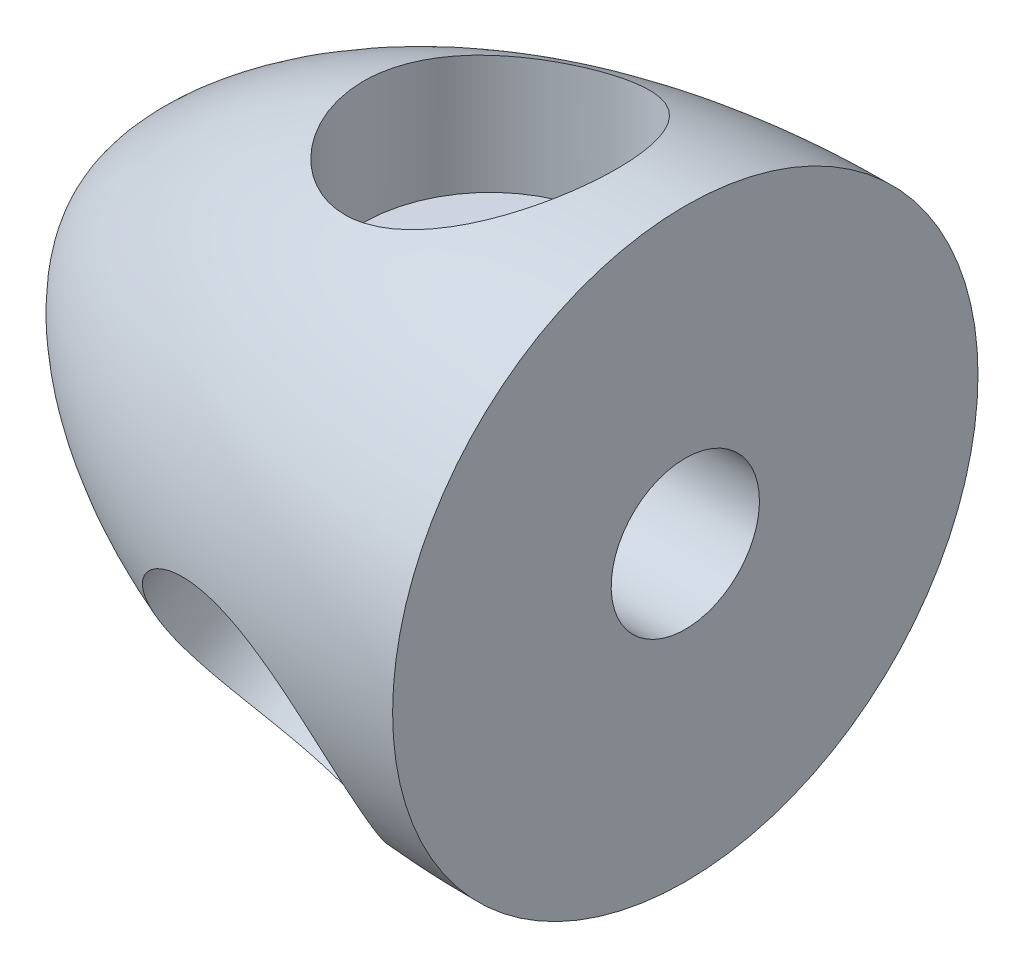
ISO-10303-21;
HEADER;
FILE_DESCRIPTION(('STEP AP214'),'2;1');
FILE_NAME('part.step','',(''),(''),'','','');
FILE_SCHEMA(('AUTOMOTIVE_DESIGN { 1 0 10303 214 1 1 1 1 }'));
ENDSEC;
DATA;
#1=APPLICATION_CONTEXT('core data for automotive mechanical design processes');
#2=APPLICATION_PROTOCOL_DEFINITION('international standard','automotive_design',2000,#1);
#3=PRODUCT_CONTEXT('',#1,'mechanical');
#4=PRODUCT('Part','Part','',(#3));
#5=PRODUCT_RELATED_PRODUCT_CATEGORY('part','',(#4));
#6=PRODUCT_DEFINITION_FORMATION('','',#4);
#7=PRODUCT_DEFINITION_CONTEXT('part definition',#1,'design');
#8=PRODUCT_DEFINITION('design','',#6,#7);
#9=PRODUCT_DEFINITION_SHAPE('','',#8);
#10=(LENGTH_UNIT() NAMED_UNIT(*) SI_UNIT(.MILLI.,.METRE.));
#11=(NAMED_UNIT(*) PLANE_ANGLE_UNIT() SI_UNIT($,.RADIAN.));
#12=(NAMED_UNIT(*) SI_UNIT($,.STERADIAN.) SOLID_ANGLE_UNIT());
#13=UNCERTAINTY_MEASURE_WITH_UNIT(LENGTH_MEASURE(1.E-05),#10,'distance_accuracy_value','');
#14=(GEOMETRIC_REPRESENTATION_CONTEXT(3) GLOBAL_UNCERTAINTY_ASSIGNED_CONTEXT((#13)) GLOBAL_UNIT_ASSIGNED_CONTEXT((#10,
#11,#12)) REPRESENTATION_CONTEXT('',''));
#15=CARTESIAN_POINT('',(0.,0.,0.));
#16=DIRECTION('',(0.,0.,1.));
#17=DIRECTION('',(1.,0.,0.));
#18=AXIS2_PLACEMENT_3D('',#15,#16,#17);
#19=CARTESIAN_POINT('',(0.,0.,0.));
#20=DIRECTION('',(1.,0.,0.));
#21=DIRECTION('',(0.,1.,0.));
#22=AXIS2_PLACEMENT_3D('',#19,#20,#21);
#23=PLANE('',#22);
#24=CARTESIAN_POINT('',(0.,0.,0.));
#25=DIRECTION('',(1.,0.,0.));
#26=DIRECTION('',(0.,1.,0.));
#27=AXIS2_PLACEMENT_3D('',#24,#25,#26);
#28=CIRCLE('',#27,4.825);
#29=CARTESIAN_POINT('',(0.,4.825,0.));
#30=VERTEX_POINT('',#29);
#31=EDGE_CURVE('E60',#30,#30,#28,.T.);
#32=ORIENTED_EDGE('',*,*,#31,.F.);
#33=EDGE_LOOP('',(#32));
#34=FACE_BOUND('',#33,.T.);
#35=CARTESIAN_POINT('',(0.,0.,0.));
#36=DIRECTION('',(1.,0.,0.));
#37=DIRECTION('',(0.,1.,0.));
#38=AXIS2_PLACEMENT_3D('',#35,#36,#37);
#39=CIRCLE('',#38,19.05);
#40=CARTESIAN_POINT('',(0.,19.05,0.));
#41=VERTEX_POINT('',#40);
#42=EDGE_CURVE('E11',#41,#41,#39,.T.);
#43=ORIENTED_EDGE('',*,*,#42,.T.);
#44=EDGE_LOOP('',(#43));
#45=FACE_BOUND('',#44,.T.);
#46=ADVANCED_FACE('F33',(#34,#45),#23,.T.);
#47=CARTESIAN_POINT('',(0.,19.05,0.));
#48=CARTESIAN_POINT('',(-25.4333333333333,19.05,0.));
#49=CARTESIAN_POINT('',(-38.1,6.30000000000003,0.));
#50=CARTESIAN_POINT('',(-38.1,0.,0.));
#51=B_SPLINE_CURVE_WITH_KNOTS('',3,(#47,#48,#49,#50),.UNSPECIFIED.,.F.,.F.,(4,4),(0.,1.),.UNSPECIFIED.);
#52=CARTESIAN_POINT('',(0.,0.,0.));
#53=DIRECTION('',(1.,0.,0.));
#54=AXIS1_PLACEMENT('',#52,#53);
#55=SURFACE_OF_REVOLUTION('',#51,#54);
#56=CARTESIAN_POINT('',(-12.7,-0.782808314860762,-17.8658637739265));
#57=CARTESIAN_POINT('',(-12.4605412191964,-0.809010097268537,-17.9112441395069));
#58=CARTESIAN_POINT('',(-12.2218116192183,-0.845969869314384,-17.9544071675341));
#59=CARTESIAN_POINT('',(-11.7476137893859,-0.940578636545913,-18.0357942444389));
#60=CARTESIAN_POINT('',(-11.512146254658,-0.998231973059112,-18.0740172546541));
#61=CARTESIAN_POINT('',(-11.0459143717464,-1.13327139302543,-18.1449808208465));
#62=CARTESIAN_POINT('',(-10.8151535660187,-1.21067178699439,-18.1777173722079));
#63=CARTESIAN_POINT('',(-10.3598431169356,-1.38411315065787,-18.2370736364306));
#64=CARTESIAN_POINT('',(-10.1352960046177,-1.48016159223076,-18.2636908880498));
#65=CARTESIAN_POINT('',(-9.69456480261892,-1.68935375830582,-18.3100634020428));
#66=CARTESIAN_POINT('',(-9.47835406963317,-1.80243614957719,-18.3298424767099));
#67=CARTESIAN_POINT('',(-9.05455452237443,-2.04482716438032,-18.3620101753979));
#68=CARTESIAN_POINT('',(-8.84696890900604,-2.17414174156891,-18.3743960781014));
#69=CARTESIAN_POINT('',(-8.44165027879485,-2.44777678486999,-18.3910851791385));
#70=CARTESIAN_POINT('',(-8.24391548319116,-2.59209452722903,-18.3953898418879));
#71=CARTESIAN_POINT('',(-7.85934755386701,-2.89458616968398,-18.3952369053858));
#72=CARTESIAN_POINT('',(-7.672514478756,-3.05276014426187,-18.3907792590311));
#73=CARTESIAN_POINT('',(-7.30257540378188,-3.38930342263076,-18.3720034195249));
#74=CARTESIAN_POINT('',(-7.12002977907378,-3.56826526648828,-18.3572439778409));
#75=CARTESIAN_POINT('',(-6.76943600952125,-3.93854471756861,-18.3166624765897));
#76=CARTESIAN_POINT('',(-6.60138091047927,-4.12985632001884,-18.2908457594565));
#77=CARTESIAN_POINT('',(-6.28093238559516,-4.52350756447016,-18.2274425860286));
#78=CARTESIAN_POINT('',(-6.12854624378324,-4.72585226914393,-18.1898506883668));
#79=CARTESIAN_POINT('',(-5.84098590828864,-5.13975275486093,-18.102318927421));
#80=CARTESIAN_POINT('',(-5.70580286140662,-5.35130372225984,-18.0523854547081));
#81=CARTESIAN_POINT('',(-5.45878509796976,-5.77367102278403,-17.9418546703385));
#82=CARTESIAN_POINT('',(-5.34625536945976,-5.9842062762982,-17.8817379941296));
#83=CARTESIAN_POINT('',(-5.13961942055577,-6.41034081785548,-17.7494346977502));
#84=CARTESIAN_POINT('',(-5.04550359676889,-6.62593740020257,-17.6772544057282));
#85=CARTESIAN_POINT('',(-4.87681693312492,-7.06025863383021,-17.520806494415));
#86=CARTESIAN_POINT('',(-4.80223722960859,-7.27898181888373,-17.4365443836656));
#87=CARTESIAN_POINT('',(-4.67358095814146,-7.71755211190671,-17.2561346276906));
#88=CARTESIAN_POINT('',(-4.61950213669058,-7.93739909365203,-17.159988290346));
#89=CARTESIAN_POINT('',(-4.53697912531533,-8.35404708928466,-16.9665315514729));
#90=CARTESIAN_POINT('',(-4.50651022069561,-8.55095134449727,-16.870301830031));
#91=CARTESIAN_POINT('',(-4.46317921330921,-8.94227257821454,-16.6692178743022));
#92=CARTESIAN_POINT('',(-4.45031580537277,-9.13668974003923,-16.5643642799505));
#93=CARTESIAN_POINT('',(-4.44235988364154,-9.52138823633618,-16.346829434809));
#94=CARTESIAN_POINT('',(-4.44726214105618,-9.71167077112775,-16.2341504967494));
#95=CARTESIAN_POINT('',(-4.47476301762476,-10.086646248822,-16.0018701536386));
#96=CARTESIAN_POINT('',(-4.49736129717471,-10.2713392989216,-15.8822688814747));
#97=CARTESIAN_POINT('',(-4.55818860561837,-10.6234640151894,-15.6441708954853));
#98=CARTESIAN_POINT('',(-4.59545837697264,-10.7912805644767,-15.5259962930948));
#99=CARTESIAN_POINT('',(-4.68509788179873,-11.1197471167671,-15.2853716737885));
#100=CARTESIAN_POINT('',(-4.73747281590798,-11.2803946294695,-15.1629201971481));
#101=CARTESIAN_POINT('',(-4.85677161239576,-11.5935602705427,-14.9148227401486));
#102=CARTESIAN_POINT('',(-4.92369317260539,-11.7460796805276,-14.7891772680508));
#103=CARTESIAN_POINT('',(-5.07145657213194,-12.0423131421777,-14.5357015641885));
#104=CARTESIAN_POINT('',(-5.15229952519227,-12.1860264880893,-14.4078711583619));
#105=CARTESIAN_POINT('',(-5.33034022249695,-12.4690711094072,-14.1464498659214));
#106=CARTESIAN_POINT('',(-5.42802115343728,-12.6080595134843,-14.0128170052718));
#107=CARTESIAN_POINT('',(-5.63672906050956,-12.8755036240972,-13.7454457988566));
#108=CARTESIAN_POINT('',(-5.74775656801022,-13.0039589109342,-13.611707449102));
#109=CARTESIAN_POINT('',(-5.98233021253153,-13.2500209865372,-13.345194667243));
#110=CARTESIAN_POINT('',(-6.10587759776776,-13.3676266913767,-13.2124203326666));
#111=CARTESIAN_POINT('',(-6.36464518150935,-13.5917757947713,-12.9488848495021));
#112=CARTESIAN_POINT('',(-6.49986957238244,-13.6983151897203,-12.8181244439912));
#113=CARTESIAN_POINT('',(-6.94797876696902,-14.0198439111685,-12.406382287535));
#114=CARTESIAN_POINT('',(-7.28154588695901,-14.2137816697349,-12.1309603286107));
#115=CARTESIAN_POINT('',(-7.99249701573419,-14.5474858659454,-11.6047484641233));
#116=CARTESIAN_POINT('',(-8.36990393976604,-14.6872238060394,-11.3539715682044));
#117=CARTESIAN_POINT('',(-8.97759387388042,-14.8604591608365,-10.9949468532924));
#118=CARTESIAN_POINT('',(-9.19536693045009,-14.9132218624605,-10.874344679459));
#119=CARTESIAN_POINT('',(-9.63998778386072,-15.0030777353524,-10.6446464084535));
#120=CARTESIAN_POINT('',(-9.86683231204893,-15.0401764959765,-10.5355462174788));
#121=CARTESIAN_POINT('',(-10.3283835467537,-15.0987171138688,-10.3302872434051));
#122=CARTESIAN_POINT('',(-10.5630936838458,-15.1201520439269,-10.2341342013995));
#123=CARTESIAN_POINT('',(-11.0387213364155,-15.1473133186741,-10.0563174148806));
#124=CARTESIAN_POINT('',(-11.2796358918223,-15.1530470190993,-9.97464690234724));
#125=CARTESIAN_POINT('',(-11.7625778210083,-15.148831545144,-9.8281945496255));
#126=CARTESIAN_POINT('',(-12.0045374308484,-15.1391104296026,-9.76318325295562));
#127=CARTESIAN_POINT('',(-12.4912389765208,-15.1044028122953,-9.64967820579606));
#128=CARTESIAN_POINT('',(-12.7359809121101,-15.079416311862,-9.60118445386451));
#129=CARTESIAN_POINT('',(-13.2261329826634,-15.0142306428809,-9.52168482575803));
#130=CARTESIAN_POINT('',(-13.4715426113173,-14.9740408835808,-9.49066816256817));
#131=CARTESIAN_POINT('',(-13.961033487477,-14.8785440134598,-9.44671517683383));
#132=CARTESIAN_POINT('',(-14.205114850229,-14.8232382362064,-9.43377725995878));
#133=CARTESIAN_POINT('',(-14.6695152379794,-14.7029186466525,-9.42653905921418));
#134=CARTESIAN_POINT('',(-14.8901216381431,-14.6390954518101,-9.43077762342878));
#135=CARTESIAN_POINT('',(-15.326537010586,-14.49910199188,-9.45452713954318));
#136=CARTESIAN_POINT('',(-15.5423462615532,-14.4229324461904,-9.47403720185544));
#137=CARTESIAN_POINT('',(-15.9673849411216,-14.2585221658651,-9.52789236542033));
#138=CARTESIAN_POINT('',(-16.1766150841391,-14.1702827474864,-9.56223584992217));
#139=CARTESIAN_POINT('',(-16.5868313272251,-13.9820492127786,-9.64503156555277));
#140=CARTESIAN_POINT('',(-16.7878174756904,-13.8820551654691,-9.69348371384223));
#141=CARTESIAN_POINT('',(-17.1721779109224,-13.6748829994183,-9.80133105954806));
#142=CARTESIAN_POINT('',(-17.3559345718448,-13.5681472823716,-9.86021584962064));
#143=CARTESIAN_POINT('',(-17.7131730553399,-13.3445025106488,-9.98907381540146));
#144=CARTESIAN_POINT('',(-17.886651181088,-13.2275898325638,-10.0590509477716));
#145=CARTESIAN_POINT('',(-18.2220488345541,-12.9840548060418,-10.2088900628887));
#146=CARTESIAN_POINT('',(-18.3839717464499,-12.8574353231596,-10.2887491326228));
#147=CARTESIAN_POINT('',(-18.6953448168885,-12.5948227351442,-10.4571605444565));
#148=CARTESIAN_POINT('',(-18.8447892334259,-12.4588253667392,-10.5457168482626));
#149=CARTESIAN_POINT('',(-19.1344710625752,-12.1737570264932,-10.7329705313621));
#150=CARTESIAN_POINT('',(-19.2742981242203,-12.0244163413494,-10.8318923467974));
#151=CARTESIAN_POINT('',(-19.5386733982195,-11.7169615864537,-11.0360903630903));
#152=CARTESIAN_POINT('',(-19.6632279097657,-11.5588511731384,-11.1413639172477));
#153=CARTESIAN_POINT('',(-19.8963735714554,-11.2343487999817,-11.356946798654));
#154=CARTESIAN_POINT('',(-20.0049568043138,-11.0679527871416,-11.4672585881874));
#155=CARTESIAN_POINT('',(-20.2053317366402,-10.7277327146794,-11.6914501450831));
#156=CARTESIAN_POINT('',(-20.2971294718257,-10.5539113529039,-11.8053286126212));
#157=CARTESIAN_POINT('',(-20.4654155171889,-10.1952228406121,-12.0382117380654));
#158=CARTESIAN_POINT('',(-20.5414697875791,-10.0101889191632,-12.1572735394713));
#159=CARTESIAN_POINT('',(-20.674790079695,-9.63412289295948,-12.3964480083597));
#160=CARTESIAN_POINT('',(-20.7320557772986,-9.44309068479033,-12.5165606939343));
#161=CARTESIAN_POINT('',(-20.8273636304451,-9.05617762611024,-12.7565775458409));
#162=CARTESIAN_POINT('',(-20.8654070741636,-8.86029710143138,-12.8764817256091));
#163=CARTESIAN_POINT('',(-20.9219820203161,-8.4649402256296,-13.1149553330591));
#164=CARTESIAN_POINT('',(-20.9405137795724,-8.26546392187122,-13.2335247782889));
#165=CARTESIAN_POINT('',(-20.9578436499569,-7.86608390455181,-13.4672866233199));
#166=CARTESIAN_POINT('',(-20.9568161645096,-7.66619984507218,-13.5824997027076));
#167=CARTESIAN_POINT('',(-20.9354622745526,-7.26569664443719,-13.8098158652024));
#168=CARTESIAN_POINT('',(-20.9151359530587,-7.06507750644753,-13.9219189616852));
#169=CARTESIAN_POINT('',(-20.8553405048699,-6.66462114147466,-14.1423536080259));
#170=CARTESIAN_POINT('',(-20.8158712168788,-6.46478392109408,-14.2506851260967));
#171=CARTESIAN_POINT('',(-20.7180881182425,-6.06746613861438,-14.4630781280623));
#172=CARTESIAN_POINT('',(-20.6597742693946,-5.86998558129368,-14.5671396033001));
#173=CARTESIAN_POINT('',(-20.5249518817585,-5.47962530567179,-14.7703268972105));
#174=CARTESIAN_POINT('',(-20.4485030331443,-5.28673273098365,-14.8694676441995));
#175=CARTESIAN_POINT('',(-20.2778549786277,-4.90649700689581,-15.0629958543927));
#176=CARTESIAN_POINT('',(-20.183655807443,-4.71915384664282,-15.1573833268934));
#177=CARTESIAN_POINT('',(-19.9781683222644,-4.35164796565476,-15.3413563089616));
#178=CARTESIAN_POINT('',(-19.8668816825867,-4.17148454358893,-15.4309422878447));
#179=CARTESIAN_POINT('',(-19.6279094204495,-3.81984468577733,-15.6054410168709));
#180=CARTESIAN_POINT('',(-19.5002162400072,-3.64837230481122,-15.6903515872829));
#181=CARTESIAN_POINT('',(-19.2276776881195,-3.31377760668062,-15.8566320729106));
#182=CARTESIAN_POINT('',(-19.0826429986075,-3.15078185054197,-15.9379465264274));
#183=CARTESIAN_POINT('',(-18.7777536392542,-2.83711174726639,-16.0961330678985));
#184=CARTESIAN_POINT('',(-18.6179059284559,-2.68643167630493,-16.173007214596));
#185=CARTESIAN_POINT('',(-18.2844147443989,-2.3988535659652,-16.3226598191815));
#186=CARTESIAN_POINT('',(-18.1107684868983,-2.26195832075871,-16.3954374453953));
#187=CARTESIAN_POINT('',(-17.7509657769628,-2.0034881483468,-16.5371770979267));
#188=CARTESIAN_POINT('',(-17.5648096598338,-1.88191281076781,-16.6061392264221));
#189=CARTESIAN_POINT('',(-17.1840425608865,-1.65703059260396,-16.7395940593867));
#190=CARTESIAN_POINT('',(-16.9895842304809,-1.55349418712382,-16.8041354072839));
#191=CARTESIAN_POINT('',(-16.591345955905,-1.36382821768515,-16.9299924122986));
#192=CARTESIAN_POINT('',(-16.3875658723727,-1.27769891407061,-16.9913080211611));
#193=CARTESIAN_POINT('',(-15.9724501510349,-1.12386081638953,-17.1108121371168));
#194=CARTESIAN_POINT('',(-15.7611196984007,-1.05613964566308,-17.1690027240827));
#195=CARTESIAN_POINT('',(-15.3325011094864,-0.939748594727,-17.2823496423948));
#196=CARTESIAN_POINT('',(-15.1152137358125,-0.891076287952263,-17.3375063594449));
#197=CARTESIAN_POINT('',(-14.7159663652898,-0.820195501817679,-17.4350816137368));
#198=CARTESIAN_POINT('',(-14.5346874746646,-0.794800532283546,-17.478005958465));
#199=CARTESIAN_POINT('',(-14.1702292839433,-0.757150222579637,-17.561720812882));
#200=CARTESIAN_POINT('',(-13.9870495267891,-0.744898120126977,-17.602510794422));
#201=CARTESIAN_POINT('',(-13.6198120038585,-0.733493661990646,-17.6818221860005));
#202=CARTESIAN_POINT('',(-13.4357543094777,-0.734340258657499,-17.7203437772202));
#203=CARTESIAN_POINT('',(-13.0676548319402,-0.748951359078316,-17.7949662397281));
#204=CARTESIAN_POINT('',(-12.8836130524838,-0.762717219298245,-17.8310668563982));
#205=CARTESIAN_POINT('',(-12.7,-0.782808314860762,-17.8658637739265));
#206=B_SPLINE_CURVE_WITH_KNOTS('',3,(#56,#57,#58,#59,#60,#61,#62,#63,#64,#65,#66,#67,#68,#69,
#70,#71,#72,#73,#74,#75,#76,#77,#78,#79,#80,#81,#82,#83,#84,#85,#86,#87,#88,#89,#90,#91,#92,#93,
#94,#95,#96,#97,#98,#99,#100,#101,#102,#103,#104,#105,#106,#107,#108,#109,#110,#111,#112,#113,
#114,#115,#116,#117,#118,#119,#120,#121,#122,#123,#124,#125,#126,#127,#128,#129,#130,#131,#132,
#133,#134,#135,#136,#137,#138,#139,#140,#141,#142,#143,#144,#145,#146,#147,#148,#149,#150,#151,
#152,#153,#154,#155,#156,#157,#158,#159,#160,#161,#162,#163,#164,#165,#166,#167,#168,#169,#170,
#171,#172,#173,#174,#175,#176,#177,#178,#179,#180,#181,#182,#183,#184,#185,#186,#187,#188,#189,
#190,#191,#192,#193,#194,#195,#196,#197,#198,#199,#200,#201,#202,#203,#204,#205),.UNSPECIFIED.,
.T.,.F.,(4,2,2,2,2,2,2,2,2,2,2,2,2,2,2,2,2,2,2,2,2,2,2,2,2,2,2,2,2,2,2,2,2,2,2,2,2,2,2,2,2,2,2,
2,2,2,2,2,2,2,2,2,2,2,2,2,2,2,2,2,2,2,2,2,2,2,2,2,2,2,2,2,2,2,4),(0.,0.735189109765677,
1.47053254596554,2.20641040021214,2.94258371592618,3.67616703726041,4.41002021353002,
5.14374039412699,5.87746451896211,6.6447145035238,7.41159420096632,8.17882880127432,
8.94566695033751,9.68319006988842,10.4203275180978,11.1571299409134,11.8938513493562,
12.5567991592394,13.2196978193407,13.8824013909569,14.5450922449544,15.170196031612,
15.795515296057,16.4207356685819,17.0460060834306,17.6937379857401,18.3414956848175,
18.9893180281542,19.6373739324057,21.0531936380813,22.4697567572263,23.2323883351739,
23.9947475532189,24.7574437151378,25.5197825068139,26.270975868211,27.0221691640337,
27.772898307371,28.5235612411407,29.2117662767927,29.8999312264577,30.5880211893419,
31.2761071121731,31.9368944790764,32.5979180828387,33.25874729116,33.9198789246246,
34.6008314404914,35.2815021446615,35.9625091419971,36.6432707796872,37.3408435285258,
38.0384283105796,38.7359663379232,39.4334951838184,40.1248073285917,40.8161164996338,
41.5074314956607,42.1987478931698,42.8878196900907,43.5768901392673,44.2658931128889,
44.9552146344643,45.6529000965906,46.3502594372285,47.0477598486321,47.7452415721548,
48.4330712404003,49.1209111951989,49.8082875322292,50.4955762783795,51.0591542816163,
51.6228710892239,52.1865428103265,52.7502737211076),.UNSPECIFIED.);
#207=CARTESIAN_POINT('',(-12.7,-0.782808314860762,-17.8658637739265));
#208=VERTEX_POINT('',#207);
#209=EDGE_CURVE('E36',#208,#208,#206,.T.);
#210=ORIENTED_EDGE('',*,*,#209,.F.);
#211=EDGE_LOOP('',(#210));
#212=FACE_BOUND('',#211,.T.);
#213=CARTESIAN_POINT('',(-12.7,-15.0808877313421,9.61086377392642));
#214=CARTESIAN_POINT('',(-12.4605412191964,-15.1070873895638,9.65624536590619));
#215=CARTESIAN_POINT('',(-12.2218116192183,-15.1259877823167,9.70983498142956));
#216=CARTESIAN_POINT('',(-11.7476137893859,-15.1491666748402,9.8324621157252));
#217=CARTESIAN_POINT('',(-11.512146254658,-15.1534421044391,9.90150287486616));
#218=CARTESIAN_POINT('',(-11.0459143717464,-15.1473786455218,10.0539322261655));
#219=CARTESIAN_POINT('',(-10.8151535660187,-15.1370291336485,10.1373312092863));
#220=CARTESIAN_POINT('',(-10.3598431169356,-15.1017124845074,10.3172139683972));
#221=CARTESIAN_POINT('',(-10.1352960046177,-15.0767394798021,10.4137029846029));
#222=CARTESIAN_POINT('',(-9.69456480261892,-15.0123031719198,10.618054971693));
#223=CARTESIAN_POINT('',(-9.47835406963317,-14.9728911574092,10.7258767325883));
#224=CARTESIAN_POINT('',(-9.05455452237443,-14.8795536942528,10.9518773584009));
#225=CARTESIAN_POINT('',(-8.84696890900603,-14.8256229120485,11.0700600186776));
#226=CARTESIAN_POINT('',(-8.44165027879484,-14.7032585758624,11.3153794680605));
#227=CARTESIAN_POINT('',(-8.24391548319116,-14.6348276519786,11.442514630535));
#228=CARTESIAN_POINT('',(-7.85934755386701,-14.4834493838551,11.7044036090824));
#229=CARTESIAN_POINT('',(-7.67251447875599,-14.4005019615819,11.8391574661071));
#230=CARTESIAN_POINT('',(-7.30257540378187,-14.2159699684077,12.1212245748943));
#231=CARTESIAN_POINT('',(-7.12002977907378,-14.113706995035,12.268830357141));
#232=CARTESIAN_POINT('',(-6.76943600952125,-13.8934226584875,12.5692110176503));
#233=CARTESIAN_POINT('',(-6.60138091047927,-13.7754089243827,12.7219833668444));
#234=CARTESIAN_POINT('',(-6.28093238559516,-13.523674543288,13.0311937580566));
#235=CARTESIAN_POINT('',(-6.12854624378324,-13.3899466525995,13.1876334637945));
#236=CARTESIAN_POINT('',(-5.84098590828864,-13.1071916811239,13.5023159185912));
#237=CARTESIAN_POINT('',(-5.70580286140662,-12.9581725415559,13.6605576941973));
#238=CARTESIAN_POINT('',(-5.45878509796975,-12.6512664241295,13.9710731139944));
#239=CARTESIAN_POINT('',(-5.34625536945975,-12.4939362285845,14.1233436538254));
#240=CARTESIAN_POINT('',(-5.13961942055577,-12.1662909421369,14.4262353440543));
#241=CARTESIAN_POINT('',(-5.04550359676888,-11.9959826844196,14.576857315325));
#242=CARTESIAN_POINT('',(-4.87681693312492,-11.6433342020396,14.8747665813929));
#243=CARTESIAN_POINT('',(-4.80223722960859,-11.4609994810273,15.0220553606712));
#244=CARTESIAN_POINT('',(-4.67358095814146,-11.085474902751,15.3116634977868));
#245=CARTESIAN_POINT('',(-4.61950213669058,-10.892286241257,15.4539834002513));
#246=CARTESIAN_POINT('',(-4.53697912531533,-10.5164237930433,15.7180827794685));
#247=CARTESIAN_POINT('',(-4.50651022069561,-10.3346342820692,15.8404920058749));
#248=CARTESIAN_POINT('',(-4.46317921330921,-9.96482985125597,16.0788441574499));
#249=CARTESIAN_POINT('',(-4.45031580537277,-9.77681539395692,16.1947875613459));
#250=CARTESIAN_POINT('',(-4.44235988364154,-9.39607544370766,16.419178809366));
#251=CARTESIAN_POINT('',(-4.44726214105618,-9.20335135348079,16.5276288493622));
#252=CARTESIAN_POINT('',(-4.47476301762475,-8.81470293670001,16.7362269672862));
#253=CARTESIAN_POINT('',(-4.49736129717471,-8.61877867163124,16.8363752044929));
#254=CARTESIAN_POINT('',(-4.55818860561837,-8.23651740904061,17.0222751610865));
#255=CARTESIAN_POINT('',(-4.59545837697264,-8.05026692664474,17.1085212547495));
#256=CARTESIAN_POINT('',(-4.68509788179874,-7.67764661740427,17.2726693236733));
#257=CARTESIAN_POINT('',(-4.73747281590798,-7.49127677155162,17.3505684124082));
#258=CARTESIAN_POINT('',(-4.85677161239576,-7.11983525063909,17.4977290846703));
#259=CARTESIAN_POINT('',(-4.92369317260539,-6.93476337493948,17.5669920322386));
#260=CARTESIAN_POINT('',(-5.07145657213194,-6.56713024532757,17.6967998835474));
#261=CARTESIAN_POINT('',(-5.15229952519227,-6.38456919354981,17.7573440890563));
#262=CARTESIAN_POINT('',(-5.33034022249695,-6.01664940254719,17.871757275302));
#263=CARTESIAN_POINT('',(-5.42802115343729,-5.8314257484057,17.9253083337394));
#264=CARTESIAN_POINT('',(-5.63672906050956,-5.46615343610327,18.0232361244151));
#265=CARTESIAN_POINT('',(-5.74775656801023,-5.28610498433708,18.067612491189));
#266=CARTESIAN_POINT('',(-5.98233021253153,-4.93226710701235,18.1474521086397));
#267=CARTESIAN_POINT('',(-6.10587759776776,-4.75847830787888,18.1829144693724));
#268=CARTESIAN_POINT('',(-6.36464518150936,-4.41817533296253,18.2452655455655));
#269=CARTESIAN_POINT('',(-6.49986957238244,-4.25166380250643,18.2721511653397));
#270=CARTESIAN_POINT('',(-6.94797876696902,-3.73432027448224,18.344732127932));
#271=CARTESIAN_POINT('',(-7.28154588695901,-3.39882898201055,18.3749761741414));
#272=CARTESIAN_POINT('',(-7.9924970157342,-2.77626404148639,18.4008665531655));
#273=CARTESIAN_POINT('',(-8.36990393976605,-2.4892159088915,18.3964947111999));
#274=CARTESIAN_POINT('',(-8.97759387388042,-2.09167370779263,18.3670085718318));
#275=CARTESIAN_POINT('',(-9.1953669304501,-1.96084781068928,18.3524013248938));
#276=CARTESIAN_POINT('',(-9.63998778386073,-1.71699533634722,18.3153696579946));
#277=CARTESIAN_POINT('',(-9.86683231204894,-1.6039624190933,18.2929480316567));
#278=CARTESIAN_POINT('',(-10.3283835467537,-1.39693262424467,18.2410162068678));
#279=CARTESIAN_POINT('',(-10.5630936838459,-1.30294418218764,18.2115028798236));
#280=CARTESIAN_POINT('',(-11.0387213364155,-1.13536969046935,18.1461168404944));
#281=CARTESIAN_POINT('',(-11.2796358918223,-1.06177410166273,18.1102471144537));
#282=CARTESIAN_POINT('',(-11.7625778210084,-0.937050380739385,18.0333702305585));
#283=CARTESIAN_POINT('',(-12.0045374308485,-0.885609504060962,17.9924458492116));
#284=CARTESIAN_POINT('',(-12.4912389765208,-0.804665058416672,17.9056356473389));
#285=CARTESIAN_POINT('',(-12.7359809121101,-0.77516148753582,17.8597498272462));
#286=CARTESIAN_POINT('',(-13.2261329826635,-0.738905624494712,17.7635475678927));
#287=CARTESIAN_POINT('',(-13.4715426113173,-0.732139285881723,17.7132338837719));
#288=CARTESIAN_POINT('',(-13.961033487477,-0.741823318724119,17.608554675398));
#289=CARTESIAN_POINT('',(-14.205114850229,-0.758271642664977,17.5541895088829));
#290=CARTESIAN_POINT('',(-14.6695152379794,-0.812162971719423,17.4463705873841));
#291=CARTESIAN_POINT('',(-14.8901216381432,-0.847745273426014,17.3932173614072));
#292=CARTESIAN_POINT('',(-15.326537010586,-0.93830968767377,17.2838542268012));
#293=CARTESIAN_POINT('',(-15.5423462615532,-0.993290670110379,17.2276444963954));
#294=CARTESIAN_POINT('',(-15.9673849411216,-1.12213575004519,17.1121885987728));
#295=CARTESIAN_POINT('',(-16.1766150841391,-1.1959977892676,17.0529427630927));
#296=CARTESIAN_POINT('',(-16.5868313272251,-1.36181774968212,16.9313255980069));
#297=CARTESIAN_POINT('',(-16.7878174756904,-1.45377556462348,16.8689542869543));
#298=CARTESIAN_POINT('',(-17.1721779109224,-1.65076018876082,16.7434616010502));
#299=CARTESIAN_POINT('',(-17.3559345718448,-1.75512377138355,16.680468153633));
#300=CARTESIAN_POINT('',(-17.7131730553399,-1.97854042909115,16.5512150827878));
#301=CARTESIAN_POINT('',(-17.886651181088,-2.09759874245016,16.4849542997268));
#302=CARTESIAN_POINT('',(-18.2220488345542,-2.34913073588317,16.348966337606));
#303=CARTESIAN_POINT('',(-18.3839717464499,-2.48160046043657,16.279240183683));
#304=CARTESIAN_POINT('',(-18.6953448168886,-2.75875531537949,16.1360167170249));
#305=CARTESIAN_POINT('',(-18.844789233426,-2.90344600834337,16.0625176930414));
#306=CARTESIAN_POINT('',(-19.1344710625752,-3.20814662498265,15.9092681101235));
#307=CARTESIAN_POINT('',(-19.2742981242203,-3.36848577271,15.829396190688));
#308=CARTESIAN_POINT('',(-19.5386733982195,-3.69905381966986,15.6652315705805));
#309=CARTESIAN_POINT('',(-19.6632279097657,-3.86927859857453,15.5809407131252));
#310=CARTESIAN_POINT('',(-19.8963735714554,-4.21823003707181,15.4077048550864));
#311=CARTESIAN_POINT('',(-20.0049568043138,-4.39696085556474,15.3187575756452));
#312=CARTESIAN_POINT('',(-20.2053317366402,-4.76122647538148,15.1362141284634));
#313=CARTESIAN_POINT('',(-20.2971294718257,-4.9467588021012,15.0426196472144));
#314=CARTESIAN_POINT('',(-20.4654155171889,-5.32778576099456,14.8484278462461));
#315=CARTESIAN_POINT('',(-20.5414697875791,-5.52341326635688,14.7477146704125));
#316=CARTESIAN_POINT('',(-20.674790079695,-5.91857744545271,14.541619172664));
#317=CARTESIAN_POINT('',(-20.7320557772986,-6.11811418656163,14.4362367702358));
#318=CARTESIAN_POINT('',(-20.8273636304451,-6.5194314069892,14.2211686583162));
#319=CARTESIAN_POINT('',(-20.8654070741636,-6.72121173502785,14.1114832377218));
#320=CARTESIAN_POINT('',(-20.9219820203161,-7.12541437511253,13.8883309434416));
#321=CARTESIAN_POINT('',(-20.9405137795724,-7.32783667867339,13.7748641195487));
#322=CARTESIAN_POINT('',(-20.9578436499569,-7.72997038356541,13.5458718013017));
#323=CARTESIAN_POINT('',(-20.9568161645096,-7.92968986690324,13.4303736676747));
#324=CARTESIAN_POINT('',(-20.9354622745526,-8.32680303863201,13.1971858028752));
#325=CARTESIAN_POINT('',(-20.9151359530587,-8.52419673702384,13.0794960811322));
#326=CARTESIAN_POINT('',(-20.8553405048699,-8.91532692311558,12.8429080191289));
#327=CARTESIAN_POINT('',(-20.8158712168788,-9.10906337998574,12.724009668693));
#328=CARTESIAN_POINT('',(-20.7180881182425,-9.49166000651382,12.4861188766731));
#329=CARTESIAN_POINT('',(-20.6597742693946,-9.6805201662854,12.3671264348988));
#330=CARTESIAN_POINT('',(-20.5249518817585,-10.0516656623489,12.1306581665371));
#331=CARTESIAN_POINT('',(-20.4485030331443,-10.2339703551357,12.0131786701503));
#332=CARTESIAN_POINT('',(-20.2778549786277,-10.5916885635558,11.7806489787605));
#333=CARTESIAN_POINT('',(-20.183655807443,-10.7671020926669,11.6655987790065));
#334=CARTESIAN_POINT('',(-19.9781683222644,-11.110180309242,11.4393158410647));
#335=CARTESIAN_POINT('',(-19.8668816825867,-11.2778457538106,11.3280827301646));
#336=CARTESIAN_POINT('',(-19.6279094204495,-11.6047860149812,11.1108030448297));
#337=CARTESIAN_POINT('',(-19.5002162400072,-11.7640569164908,11.0047588920716));
#338=CARTESIAN_POINT('',(-19.2276776881195,-12.0753573902633,10.7981316263328));
#339=CARTESIAN_POINT('',(-19.0826429986075,-12.2272756507731,10.6976303875661));
#340=CARTESIAN_POINT('',(-18.7777536392542,-12.5211042658616,10.5050773804572));
#341=CARTESIAN_POINT('',(-18.6179059284559,-12.6630192652766,10.4130216845093));
#342=CARTESIAN_POINT('',(-18.2844147443989,-12.93641127776,10.2387980376756));
#343=CARTESIAN_POINT('',(-18.1107684868983,-13.0678861734916,10.1566320907763));
#344=CARTESIAN_POINT('',(-17.7509657769628,-13.3198713995133,10.0036601816128));
#345=CARTESIAN_POINT('',(-17.5648096598338,-13.4403820234789,9.93285391504341));
#346=CARTESIAN_POINT('',(-17.1840425608865,-13.6683984081659,9.80482761773642));
#347=CARTESIAN_POINT('',(-16.9895842304809,-13.7760610577795,9.7474331343227));
#348=CARTESIAN_POINT('',(-16.591345955905,-13.9798894060857,9.64610608906275));
#349=CARTESIAN_POINT('',(-16.3875658723727,-14.0760549328165,9.60217372855357));
#350=CARTESIAN_POINT('',(-15.9724501510349,-14.2564675819314,9.52869808586972));
#351=CARTESIAN_POINT('',(-15.7611196984007,-14.3407226938682,9.49914512512952));
#352=CARTESIAN_POINT('',(-15.3325011094864,-14.4970795300353,9.4550209774018));
#353=CARTESIAN_POINT('',(-15.1152137358125,-14.5691828015774,9.44044788179912));
#354=CARTESIAN_POINT('',(-14.7159663652898,-14.6891258436421,9.42785094751229));
#355=CARTESIAN_POINT('',(-14.5346874746646,-14.7389969013847,9.42732043113151));
#356=CARTESIAN_POINT('',(-14.1702292839433,-14.8303212468359,9.43657173367609));
#357=CARTESIAN_POINT('',(-13.9870495267891,-14.8717724582957,9.44635609247232));
#358=CARTESIAN_POINT('',(-13.6198120038585,-14.9461603672804,9.47613523779911));
#359=CARTESIAN_POINT('',(-13.4357543094777,-14.9790977455374,9.49612920762921));
#360=CARTESIAN_POINT('',(-13.0676548319402,-15.0364171435518,9.54609402302483));
#361=CARTESIAN_POINT('',(-12.8836130524838,-15.0607982645704,9.57606591601527));
#362=CARTESIAN_POINT('',(-12.7,-15.0808877313421,9.61086377392642));
#363=B_SPLINE_CURVE_WITH_KNOTS('',3,(#213,#214,#215,#216,#217,#218,#219,#220,#221,#222,#223,
#224,#225,#226,#227,#228,#229,#230,#231,#232,#233,#234,#235,#236,#237,#238,#239,#240,#241,#242,
#243,#244,#245,#246,#247,#248,#249,#250,#251,#252,#253,#254,#255,#256,#257,#258,#259,#260,#261,
#262,#263,#264,#265,#266,#267,#268,#269,#270,#271,#272,#273,#274,#275,#276,#277,#278,#279,#280,
#281,#282,#283,#284,#285,#286,#287,#288,#289,#290,#291,#292,#293,#294,#295,#296,#297,#298,#299,
#300,#301,#302,#303,#304,#305,#306,#307,#308,#309,#310,#311,#312,#313,#314,#315,#316,#317,#318,
#319,#320,#321,#322,#323,#324,#325,#326,#327,#328,#329,#330,#331,#332,#333,#334,#335,#336,#337,
#338,#339,#340,#341,#342,#343,#344,#345,#346,#347,#348,#349,#350,#351,#352,#353,#354,#355,#356,
#357,#358,#359,#360,#361,#362),.UNSPECIFIED.,.T.,.F.,(4,2,2,2,2,2,2,2,2,2,2,2,2,2,2,2,2,2,2,2,2,
2,2,2,2,2,2,2,2,2,2,2,2,2,2,2,2,2,2,2,2,2,2,2,2,2,2,2,2,2,2,2,2,2,2,2,2,2,2,2,2,2,2,2,2,2,2,2,2,
2,2,2,2,2,4),(0.,0.735189109765676,1.47053254596554,2.20641040021214,2.94258371592619,
3.67616703726042,4.41002021353003,5.143740394127,5.87746451896212,6.64471450352381,
7.41159420096633,8.17882880127433,8.94566695033752,9.68319006988843,10.4203275180978,
11.1571299409134,11.8938513493562,12.5567991592394,13.2196978193407,13.882401390957,
14.5450922449545,15.170196031612,15.795515296057,16.4207356685819,17.0460060834306,
17.6937379857401,18.3414956848175,18.9893180281542,19.6373739324057,21.0531936380813,
22.4697567572263,23.2323883351739,23.9947475532189,24.7574437151378,25.5197825068139,
26.270975868211,27.0221691640337,27.772898307371,28.5235612411407,29.2117662767927,
29.8999312264577,30.5880211893419,31.2761071121731,31.9368944790764,32.5979180828387,
33.25874729116,33.9198789246246,34.6008314404914,35.2815021446615,35.9625091419971,
36.6432707796872,37.3408435285258,38.0384283105796,38.7359663379232,39.4334951838184,
40.1248073285917,40.8161164996338,41.5074314956607,42.1987478931699,42.8878196900907,
43.5768901392673,44.265893112889,44.9552146344643,45.6529000965906,46.3502594372285,
47.0477598486321,47.7452415721548,48.4330712404003,49.1209111951989,49.8082875322292,
50.4955762783795,51.0591542816163,51.6228710892239,52.1865428103265,52.7502737211076),.UNSPECIFIED.);
#364=CARTESIAN_POINT('',(-12.7,-15.0808877313421,9.61086377392642));
#365=VERTEX_POINT('',#364);
#366=EDGE_CURVE('E73',#365,#365,#363,.T.);
#367=ORIENTED_EDGE('',*,*,#366,.F.);
#368=EDGE_LOOP('',(#367));
#369=FACE_BOUND('',#368,.T.);
#370=CARTESIAN_POINT('',(-4.445,18.9161500823839,0.));
#371=CARTESIAN_POINT('',(-4.44500015148331,18.9161499737645,-0.21608185105438));
#372=CARTESIAN_POINT('',(-4.45349308688684,18.9119212370939,-0.432166217679756));
#373=CARTESIAN_POINT('',(-4.48736113503262,18.8950908839472,-0.862677501060321));
#374=CARTESIAN_POINT('',(-4.5127364594152,18.8824891625061,-1.0771043970031));
#375=CARTESIAN_POINT('',(-4.58007159817501,18.8491588462773,-1.5027388067984));
#376=CARTESIAN_POINT('',(-4.62203495027855,18.8284285179103,-1.71394562391947));
#377=CARTESIAN_POINT('',(-4.72206274747847,18.7792402324895,-2.13158441248186));
#378=CARTESIAN_POINT('',(-4.78012724833394,18.7507822486745,-2.33801636738492));
#379=CARTESIAN_POINT('',(-4.9115388259069,18.6867575921307,-2.74414317708622));
#380=CARTESIAN_POINT('',(-4.98484153265514,18.6512115700435,-2.9438556779186));
#381=CARTESIAN_POINT('',(-5.14609897343812,18.5735829447814,-3.33594703964567));
#382=CARTESIAN_POINT('',(-5.23405365080985,18.531500366885,-3.52832592889782));
#383=CARTESIAN_POINT('',(-5.42381183570465,18.4414978319829,-3.90467951885298));
#384=CARTESIAN_POINT('',(-5.52561455776635,18.3935782060706,-4.08865469542473));
#385=CARTESIAN_POINT('',(-5.74227635567932,18.2926304868323,-4.44736268848162));
#386=CARTESIAN_POINT('',(-5.85714046421887,18.2396004256107,-4.62209190414405));
#387=CARTESIAN_POINT('',(-6.10537546245284,18.1263428339846,-4.9703133662741));
#388=CARTESIAN_POINT('',(-6.23939918310714,18.0658841545034,-5.14326564080204));
#389=CARTESIAN_POINT('',(-6.51998940957918,17.9411137139785,-5.47723544331467));
#390=CARTESIAN_POINT('',(-6.66656051655023,17.8768005420993,-5.63824855244159));
#391=CARTESIAN_POINT('',(-7.12364849906012,17.6795033707355,-6.10227281260695));
#392=CARTESIAN_POINT('',(-7.45167742451271,17.5420979542496,-6.38646038853048));
#393=CARTESIAN_POINT('',(-8.1799227133687,17.2499962574139,-6.9236906220838));
#394=CARTESIAN_POINT('',(-8.58403074832502,17.0948924939063,-7.17125771081696));
#395=CARTESIAN_POINT('',(-9.21823486078659,16.8660727904981,-7.48855188612258));
#396=CARTESIAN_POINT('',(-9.43447374916385,16.7903864029565,-7.58535678746738));
#397=CARTESIAN_POINT('',(-9.87517707239744,16.641487009849,-7.7602532340967));
#398=CARTESIAN_POINT('',(-10.0996381503196,16.5682730178152,-7.83835232049302));
#399=CARTESIAN_POINT('',(-10.5619463364258,16.4234951028089,-7.97706939564376));
#400=CARTESIAN_POINT('',(-10.7999923855016,16.3520355853755,-8.03713363268169));
#401=CARTESIAN_POINT('',(-11.2818208750536,16.2142586212583,-8.13598408730736));
#402=CARTESIAN_POINT('',(-11.5256007447108,16.147938925282,-8.17477965816934));
#403=CARTESIAN_POINT('',(-12.0172019462574,16.0215815929743,-8.2304304337826));
#404=CARTESIAN_POINT('',(-12.265022149077,15.961542235241,-8.24729166516821));
#405=CARTESIAN_POINT('',(-12.7628195869094,15.8487383257702,-8.25851332064177));
#406=CARTESIAN_POINT('',(-13.0127966294544,15.7959731319053,-8.2528757321323));
#407=CARTESIAN_POINT('',(-13.4960835165354,15.7017616326991,-8.21985212797007));
#408=CARTESIAN_POINT('',(-13.7293932878124,15.6597951926131,-8.19394134788401));
#409=CARTESIAN_POINT('',(-14.1941408513342,15.5833169813272,-8.12205924814109));
#410=CARTESIAN_POINT('',(-14.4255787222788,15.5488048951417,-8.07608877635953));
#411=CARTESIAN_POINT('',(-14.8845320618667,15.4874252579325,-7.96420840484873));
#412=CARTESIAN_POINT('',(-15.1120488733159,15.4605550389614,-7.89830548060763));
#413=CARTESIAN_POINT('',(-15.5612473952319,15.4143501123591,-7.74689974223325));
#414=CARTESIAN_POINT('',(-15.7829293527284,15.3950150852311,-7.66139775935614));
#415=CARTESIAN_POINT('',(-16.2034079789528,15.36460363515,-7.47797243776267));
#416=CARTESIAN_POINT('',(-16.4027260923277,15.3530478322923,-7.38132015125476));
#417=CARTESIAN_POINT('',(-16.7931284950672,15.3356518502105,-7.17219321331332));
#418=CARTESIAN_POINT('',(-16.984213225273,15.3298113646059,-7.0597194103923));
#419=CARTESIAN_POINT('',(-17.3567832552692,15.3231980868656,-6.81971436536386));
#420=CARTESIAN_POINT('',(-17.5382679035824,15.3224256382186,-6.69218210325832));
#421=CARTESIAN_POINT('',(-17.8903671436648,15.3251805650771,-6.42294576837301));
#422=CARTESIAN_POINT('',(-18.0609814554564,15.328708051285,-6.28124133081436));
#423=CARTESIAN_POINT('',(-18.3914493581313,15.3392535696852,-5.98349983904414));
#424=CARTESIAN_POINT('',(-18.5512112823168,15.3462979341382,-5.82736201394724));
#425=CARTESIAN_POINT('',(-18.8575631467251,15.362981243812,-5.50266167198663));
#426=CARTESIAN_POINT('',(-19.0041472011916,15.372621340785,-5.3340936638951));
#427=CARTESIAN_POINT('',(-19.2831484598061,15.393575425317,-4.98567913141702));
#428=CARTESIAN_POINT('',(-19.4155638188784,15.4048896304257,-4.80583114295397));
#429=CARTESIAN_POINT('',(-19.6653179060895,15.4282899587912,-4.43611536383573));
#430=CARTESIAN_POINT('',(-19.7826628672204,15.4403757598058,-4.24625176169023));
#431=CARTESIAN_POINT('',(-20.005515627376,15.4649118649874,-3.85069105207165));
#432=CARTESIAN_POINT('',(-20.1104502461594,15.4773597530538,-3.64467055126313));
#433=CARTESIAN_POINT('',(-20.3026937060812,15.5013335351254,-3.2245076142368));
#434=CARTESIAN_POINT('',(-20.3900021534918,15.5128594085315,-3.01036499671669));
#435=CARTESIAN_POINT('',(-20.5463712411018,15.5342509927643,-2.57543859308376));
#436=CARTESIAN_POINT('',(-20.6154321694023,15.5441167298011,-2.35465491188474));
#437=CARTESIAN_POINT('',(-20.7348022596904,15.5615842474131,-1.90798765546689));
#438=CARTESIAN_POINT('',(-20.7851115715658,15.5691860460845,-1.68210412102813));
#439=CARTESIAN_POINT('',(-20.8666885630467,15.5816875903014,-1.22634780848849));
#440=CARTESIAN_POINT('',(-20.8979151557678,15.5865815033894,-0.996467511013576));
#441=CARTESIAN_POINT('',(-20.9409160142615,15.5933555094579,-0.534848838821361));
#442=CARTESIAN_POINT('',(-20.9526902103128,15.5952355916361,-0.303110457447301));
#443=CARTESIAN_POINT('',(-20.956694097566,15.5958727934311,0.160527937899804));
#444=CARTESIAN_POINT('',(-20.9489247495982,15.5946300665763,0.392427943366465));
#445=CARTESIAN_POINT('',(-20.9139042196465,15.5890939831876,0.854713720361034));
#446=CARTESIAN_POINT('',(-20.8866531731821,15.5848006478745,1.08509950241101));
#447=CARTESIAN_POINT('',(-20.8132682612303,15.5734741965518,1.5402894417439));
#448=CARTESIAN_POINT('',(-20.7673355581692,15.5664703053461,1.76512680178167));
#449=CARTESIAN_POINT('',(-20.6569440658049,15.5501288422367,2.21011690555097));
#450=CARTESIAN_POINT('',(-20.5924853986141,15.5407912857151,2.4302696801503));
#451=CARTESIAN_POINT('',(-20.4455005680284,15.5203390902338,2.86439696731906));
#452=CARTESIAN_POINT('',(-20.3629725567079,15.5092242695473,3.07837084544652));
#453=CARTESIAN_POINT('',(-20.1804318506836,15.4859098498798,3.49866518564119));
#454=CARTESIAN_POINT('',(-20.0804189619904,15.4737102388641,3.70498556276434));
#455=CARTESIAN_POINT('',(-19.8626239502144,15.4489215147338,4.11038435940057));
#456=CARTESIAN_POINT('',(-19.7446912815294,15.4363298979214,4.30938176332254));
#457=CARTESIAN_POINT('',(-19.492469259296,15.4117773514509,4.69689872192939));
#458=CARTESIAN_POINT('',(-19.3581723880773,15.3998167153066,4.88541340252442));
#459=CARTESIAN_POINT('',(-19.0741653875378,15.377520279124,5.25057555279426));
#460=CARTESIAN_POINT('',(-18.9244543352976,15.3671845764718,5.42722231083316));
#461=CARTESIAN_POINT('',(-18.6107226021377,15.349166543159,5.76731120827765));
#462=CARTESIAN_POINT('',(-18.4467087742371,15.3414829504241,5.93075960001693));
#463=CARTESIAN_POINT('',(-18.105130713661,15.3297703649316,6.24366343445888));
#464=CARTESIAN_POINT('',(-17.9275412568136,15.3257483637413,6.39309162080794));
#465=CARTESIAN_POINT('',(-17.5603790842484,15.3223631594358,6.6764899789365));
#466=CARTESIAN_POINT('',(-17.3708063449686,15.3229999654812,6.81046012032037));
#467=CARTESIAN_POINT('',(-16.9811813066937,15.3298158250934,7.06188708880714));
#468=CARTESIAN_POINT('',(-16.7811322992462,15.3359931476016,7.17934906040405));
#469=CARTESIAN_POINT('',(-16.3720913072634,15.3546273427583,7.39692013674686));
#470=CARTESIAN_POINT('',(-16.1630996361827,15.3670839954711,7.49702984909652));
#471=CARTESIAN_POINT('',(-15.7451424269831,15.398282568385,7.67606960981413));
#472=CARTESIAN_POINT('',(-15.5364191138923,15.4167956268232,7.7556055755577));
#473=CARTESIAN_POINT('',(-15.1138509650379,15.4604840829188,7.89734188166057));
#474=CARTESIAN_POINT('',(-14.9000062569924,15.485659314591,7.95954265383968));
#475=CARTESIAN_POINT('',(-14.4688634039497,15.5427512174912,8.06631687425832));
#476=CARTESIAN_POINT('',(-14.2515654769942,15.5746674646325,8.11089143088126));
#477=CARTESIAN_POINT('',(-13.8151411343968,15.6451097743194,8.18232113904686));
#478=CARTESIAN_POINT('',(-13.5960147102796,15.6836358675184,8.20917620841177));
#479=CARTESIAN_POINT('',(-13.1603615897192,15.7664249208127,8.24501326954385));
#480=CARTESIAN_POINT('',(-12.943838068898,15.8106069220389,8.25422273808887));
#481=CARTESIAN_POINT('',(-12.5119725062598,15.9046049303208,8.25568293031782));
#482=CARTESIAN_POINT('',(-12.2966304480345,15.9544208589233,8.24793389012407));
#483=CARTESIAN_POINT('',(-11.868423658629,16.0590782006377,8.21581442672808));
#484=CARTESIAN_POINT('',(-11.6555590006578,16.1139197618379,8.19144351359991));
#485=CARTESIAN_POINT('',(-11.2334224974887,16.2279387906796,8.12648791463397));
#486=CARTESIAN_POINT('',(-11.0241520637206,16.2871179156813,8.08589700457047));
#487=CARTESIAN_POINT('',(-10.5979675300862,16.4126694941099,7.98606241646736));
#488=CARTESIAN_POINT('',(-10.3813441756436,16.4792604781303,7.92584887272941));
#489=CARTESIAN_POINT('',(-9.95453751203029,16.6154568004459,7.78831053047517));
#490=CARTESIAN_POINT('',(-9.7443566544545,16.6850632625052,7.71097930789946));
#491=CARTESIAN_POINT('',(-9.12513701391742,16.8968875173612,7.45419030576131));
#492=CARTESIAN_POINT('',(-8.72718718256068,17.042180524777,7.2498817274002));
#493=CARTESIAN_POINT('',(-7.93990586972511,17.3438281959696,6.76145696828145));
#494=CARTESIAN_POINT('',(-7.55362374801996,17.5001688967203,6.47238882485908));
#495=CARTESIAN_POINT('',(-7.01479998137592,17.7265705047854,5.99014461358911));
#496=CARTESIAN_POINT('',(-6.84185303668482,17.800734641058,5.82115572798486));
#497=CARTESIAN_POINT('',(-6.5107269089409,17.945077198002,5.46776672264888));
#498=CARTESIAN_POINT('',(-6.35254107890449,18.0152574070197,5.28337361108447));
#499=CARTESIAN_POINT('',(-6.05215323767272,18.1503786883123,4.90005067670827));
#500=CARTESIAN_POINT('',(-5.90995914234776,18.2153171614906,4.70111373442619));
#501=CARTESIAN_POINT('',(-5.64304337361215,18.3386176911146,4.29003528579839));
#502=CARTESIAN_POINT('',(-5.51831365115899,18.396982774685,4.07789992793116));
#503=CARTESIAN_POINT('',(-5.28768263882367,18.5059060795713,3.64188994844763));
#504=CARTESIAN_POINT('',(-5.1817692467445,18.5564693160696,3.4180229931836));
#505=CARTESIAN_POINT('',(-4.98998414206581,18.6486891504159,2.96011193478525));
#506=CARTESIAN_POINT('',(-4.90410870836337,18.6903474018229,2.72606973081401));
#507=CARTESIAN_POINT('',(-4.76578775069524,18.7578009155518,2.28846714072385));
#508=CARTESIAN_POINT('',(-4.71017816693027,18.7850736006812,2.086128262723));
#509=CARTESIAN_POINT('',(-4.61440459438363,18.8321940292754,1.67699020552334));
#510=CARTESIAN_POINT('',(-4.57423856365515,18.8520427543267,1.47019161980833));
#511=CARTESIAN_POINT('',(-4.50980179466951,18.883945690649,1.05360729757679));
#512=CARTESIAN_POINT('',(-4.48552573289296,18.8960025123767,0.843822585575191));
#513=CARTESIAN_POINT('',(-4.45312441739995,18.9121049320347,0.422692761965343));
#514=CARTESIAN_POINT('',(-4.44499985183563,18.9161501886236,0.211347584256792));
#515=CARTESIAN_POINT('',(-4.445,18.9161500823839,0.));
#516=B_SPLINE_CURVE_WITH_KNOTS('',3,(#370,#371,#372,#373,#374,#375,#376,#377,#378,#379,#380,
#381,#382,#383,#384,#385,#386,#387,#388,#389,#390,#391,#392,#393,#394,#395,#396,#397,#398,#399,
#400,#401,#402,#403,#404,#405,#406,#407,#408,#409,#410,#411,#412,#413,#414,#415,#416,#417,#418,
#419,#420,#421,#422,#423,#424,#425,#426,#427,#428,#429,#430,#431,#432,#433,#434,#435,#436,#437,
#438,#439,#440,#441,#442,#443,#444,#445,#446,#447,#448,#449,#450,#451,#452,#453,#454,#455,#456,
#457,#458,#459,#460,#461,#462,#463,#464,#465,#466,#467,#468,#469,#470,#471,#472,#473,#474,#475,
#476,#477,#478,#479,#480,#481,#482,#483,#484,#485,#486,#487,#488,#489,#490,#491,#492,#493,#494,
#495,#496,#497,#498,#499,#500,#501,#502,#503,#504,#505,#506,#507,#508,#509,#510,#511,#512,#513,
#514,#515),.UNSPECIFIED.,.T.,.F.,(4,2,2,2,2,2,2,2,2,2,2,2,2,2,2,2,2,2,2,2,2,2,2,2,2,2,2,2,2,2,2,
2,2,2,2,2,2,2,2,2,2,2,2,2,2,2,2,2,2,2,2,2,2,2,2,2,2,2,2,2,2,2,2,2,2,2,2,2,2,2,2,2,4),(0.,
0.648042991972373,1.29609410806821,1.94428350856446,2.59247515380117,3.23880521450457,
3.88513277573835,4.53142369253399,5.17796448119968,5.85823122423116,6.5387484999459,
7.89905850984564,9.38782975607941,10.1332767940787,10.8784228028392,11.6445368836741,
12.4103137814018,13.175880231363,13.941379057552,14.6558349502843,15.3702606475953,
16.0844366158227,16.7985822992599,17.4632485787894,18.1278792256541,18.7925549177206,
19.4572477223387,20.1269937121571,20.7970373660215,21.4671681683933,22.1370209114606,
22.8308218008343,23.5246381863928,24.2184436169691,24.9122435016153,25.6075319872412,
26.3028229649186,26.9980797602787,27.6933317193046,28.3812875209993,29.0692387881921,
29.7572604440534,30.4452897337915,31.1394563178352,31.8339430110047,32.5284713105619,
33.222668643891,33.9181887379177,34.6137101995433,35.3090144306717,36.0042943102253,
36.6758603298908,37.3474096193451,38.0189166732724,38.6904268414301,39.3532204642066,
40.0160048586144,40.6788087892859,41.3418673074956,42.0445567790842,42.7475104100486,
44.1526743768199,45.6665635627987,46.4245579377867,47.1822093211804,47.9402341046909,
48.6979083689009,49.4550935375313,50.2121379827282,50.8462520039727,51.4802821537971,
52.1140997794977,52.7479444091119),.UNSPECIFIED.);
#517=CARTESIAN_POINT('',(-4.445,18.9161500823839,0.));
#518=VERTEX_POINT('',#517);
#519=EDGE_CURVE('E43',#518,#518,#516,.T.);
#520=ORIENTED_EDGE('',*,*,#519,.F.);
#521=EDGE_LOOP('',(#520));
#522=FACE_BOUND('',#521,.T.);
#523=CARTESIAN_POINT('',(-38.1,0.,0.));
#524=VERTEX_POINT('',#523);
#525=VERTEX_LOOP('',#524);
#526=FACE_BOUND('',#525,.T.);
#527=ORIENTED_EDGE('',*,*,#42,.F.);
#528=EDGE_LOOP('',(#527));
#529=FACE_BOUND('',#528,.T.);
#530=ADVANCED_FACE('F47',(#212,#369,#522,#526,#529),#55,.F.);
#531=CARTESIAN_POINT('',(-12.7,7.62,0.));
#532=DIRECTION('',(0.,1.,0.));
#533=DIRECTION('',(0.,0.,1.));
#534=AXIS2_PLACEMENT_3D('',#531,#532,#533);
#535=CYLINDRICAL_SURFACE('',#534,8.255);
#536=ORIENTED_EDGE('',*,*,#519,.T.);
#537=EDGE_LOOP('',(#536));
#538=FACE_BOUND('',#537,.T.);
#539=CARTESIAN_POINT('',(-12.7,7.62,0.));
#540=DIRECTION('',(0.,1.,0.));
#541=DIRECTION('',(0.,0.,1.));
#542=AXIS2_PLACEMENT_3D('',#539,#540,#541);
#543=CIRCLE('',#542,8.255);
#544=CARTESIAN_POINT('',(-12.7,7.62,8.255));
#545=VERTEX_POINT('',#544);
#546=EDGE_CURVE('E74',#545,#545,#543,.T.);
#547=ORIENTED_EDGE('',*,*,#546,.F.);
#548=EDGE_LOOP('',(#547));
#549=FACE_BOUND('',#548,.T.);
#550=ADVANCED_FACE('F50',(#538,#549),#535,.F.);
#551=CARTESIAN_POINT('',(-12.7,7.62,0.));
#552=DIRECTION('',(0.,1.,0.));
#553=DIRECTION('',(0.,0.,1.));
#554=AXIS2_PLACEMENT_3D('',#551,#552,#553);
#555=PLANE('',#554);
#556=ORIENTED_EDGE('',*,*,#546,.T.);
#557=EDGE_LOOP('',(#556));
#558=FACE_BOUND('',#557,.T.);
#559=ADVANCED_FACE('F101',(#558),#555,.T.);
#560=CARTESIAN_POINT('',(-12.7,-3.81000000000003,6.59911357683741));
#561=DIRECTION('',(0.,-0.500000000000004,0.866025403784436));
#562=DIRECTION('',(0.,-0.866025403784436,-0.500000000000004));
#563=AXIS2_PLACEMENT_3D('',#560,#561,#562);
#564=CYLINDRICAL_SURFACE('',#563,8.255);
#565=ORIENTED_EDGE('',*,*,#366,.T.);
#566=EDGE_LOOP('',(#565));
#567=FACE_BOUND('',#566,.T.);
#568=CARTESIAN_POINT('',(-12.7,-3.81000000000003,6.59911357683741));
#569=DIRECTION('',(0.,-0.500000000000004,0.866025403784436));
#570=DIRECTION('',(0.,-0.866025403784436,-0.500000000000004));
#571=AXIS2_PLACEMENT_3D('',#568,#569,#570);
#572=CIRCLE('',#571,8.255);
#573=CARTESIAN_POINT('',(-12.7,-10.9590397082406,2.47161357683738));
#574=VERTEX_POINT('',#573);
#575=EDGE_CURVE('E70',#574,#574,#572,.T.);
#576=ORIENTED_EDGE('',*,*,#575,.F.);
#577=EDGE_LOOP('',(#576));
#578=FACE_BOUND('',#577,.T.);
#579=ADVANCED_FACE('F96',(#567,#578),#564,.F.);
#580=CARTESIAN_POINT('',(-12.7,-3.81000000000003,6.59911357683741));
#581=DIRECTION('',(0.,-0.500000000000004,0.866025403784436));
#582=DIRECTION('',(0.,-0.866025403784436,-0.500000000000004));
#583=AXIS2_PLACEMENT_3D('',#580,#581,#582);
#584=PLANE('',#583);
#585=ORIENTED_EDGE('',*,*,#575,.T.);
#586=EDGE_LOOP('',(#585));
#587=FACE_BOUND('',#586,.T.);
#588=ADVANCED_FACE('F100',(#587),#584,.T.);
#589=CARTESIAN_POINT('',(-12.7,-3.80999999999994,-6.59911357683746));
#590=DIRECTION('',(0.,-0.499999999999992,-0.866025403784443));
#591=DIRECTION('',(0.,0.866025403784443,-0.499999999999992));
#592=AXIS2_PLACEMENT_3D('',#589,#590,#591);
#593=CYLINDRICAL_SURFACE('',#592,8.255);
#594=ORIENTED_EDGE('',*,*,#209,.T.);
#595=EDGE_LOOP('',(#594));
#596=FACE_BOUND('',#595,.T.);
#597=CARTESIAN_POINT('',(-12.7,-3.80999999999994,-6.59911357683746));
#598=DIRECTION('',(0.,-0.499999999999992,-0.866025403784443));
#599=DIRECTION('',(0.,0.866025403784443,-0.499999999999992));
#600=AXIS2_PLACEMENT_3D('',#597,#598,#599);
#601=CIRCLE('',#600,8.255);
#602=CARTESIAN_POINT('',(-12.7,3.33903970824064,-10.7266135768374));
#603=VERTEX_POINT('',#602);
#604=EDGE_CURVE('E65',#603,#603,#601,.T.);
#605=ORIENTED_EDGE('',*,*,#604,.F.);
#606=EDGE_LOOP('',(#605));
#607=FACE_BOUND('',#606,.T.);
#608=ADVANCED_FACE('F138',(#596,#607),#593,.F.);
#609=CARTESIAN_POINT('',(-12.7,-3.80999999999994,-6.59911357683746));
#610=DIRECTION('',(0.,-0.499999999999992,-0.866025403784443));
#611=DIRECTION('',(0.,0.866025403784443,-0.499999999999992));
#612=AXIS2_PLACEMENT_3D('',#609,#610,#611);
#613=PLANE('',#612);
#614=ORIENTED_EDGE('',*,*,#604,.T.);
#615=EDGE_LOOP('',(#614));
#616=FACE_BOUND('',#615,.T.);
#617=ADVANCED_FACE('F147',(#616),#613,.T.);
#618=CARTESIAN_POINT('',(-12.7,0.,0.));
#619=DIRECTION('',(1.,0.,0.));
#620=DIRECTION('',(0.,1.,0.));
#621=AXIS2_PLACEMENT_3D('',#618,#619,#620);
#622=CYLINDRICAL_SURFACE('',#621,4.825);
#623=CARTESIAN_POINT('',(-12.7,0.,0.));
#624=DIRECTION('',(1.,0.,0.));
#625=DIRECTION('',(0.,1.,0.));
#626=AXIS2_PLACEMENT_3D('',#623,#624,#625);
#627=CIRCLE('',#626,4.825);
#628=CARTESIAN_POINT('',(-12.7,4.825,0.));
#629=VERTEX_POINT('',#628);
#630=EDGE_CURVE('E62',#629,#629,#627,.T.);
#631=ORIENTED_EDGE('',*,*,#630,.F.);
#632=EDGE_LOOP('',(#631));
#633=FACE_BOUND('',#632,.T.);
#634=ORIENTED_EDGE('',*,*,#31,.T.);
#635=EDGE_LOOP('',(#634));
#636=FACE_BOUND('',#635,.T.);
#637=ADVANCED_FACE('F155',(#633,#636),#622,.F.);
#638=CARTESIAN_POINT('',(-12.7,0.,0.));
#639=DIRECTION('',(1.,0.,0.));
#640=DIRECTION('',(0.,1.,0.));
#641=AXIS2_PLACEMENT_3D('',#638,#639,#640);
#642=PLANE('',#641);
#643=ORIENTED_EDGE('',*,*,#630,.T.);
#644=EDGE_LOOP('',(#643));
#645=FACE_BOUND('',#644,.T.);
#646=ADVANCED_FACE('F169',(#645),#642,.T.);
#647=CLOSED_SHELL('',(#46,#530,#550,#559,#579,#588,#608,#617,#637,#646));
#648=MANIFOLD_SOLID_BREP('B2',#647);
#649=ADVANCED_BREP_SHAPE_REPRESENTATION('',(#18,#648),#14);
#650=SHAPE_DEFINITION_REPRESENTATION(#9,#649);
ENDSEC;
END-ISO-10303-21;
